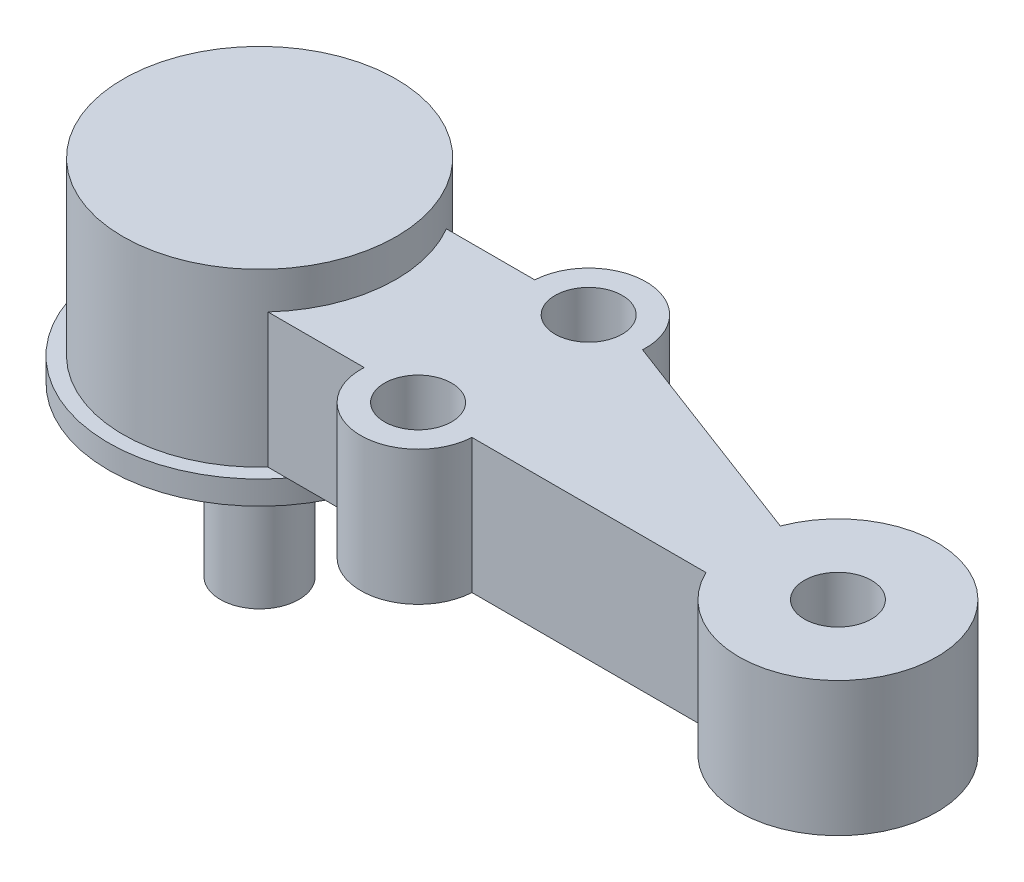
ISO-10303-21;
HEADER;
FILE_DESCRIPTION(('STEP AP214'),'2;1');
FILE_NAME('part.step','',(''),(''),'','','');
FILE_SCHEMA(('AUTOMOTIVE_DESIGN { 1 0 10303 214 1 1 1 1 }'));
ENDSEC;
DATA;
#1=APPLICATION_CONTEXT('core data for automotive mechanical design processes');
#2=APPLICATION_PROTOCOL_DEFINITION('international standard','automotive_design',2000,#1);
#3=PRODUCT_CONTEXT('',#1,'mechanical');
#4=PRODUCT('Part','Part','',(#3));
#5=PRODUCT_RELATED_PRODUCT_CATEGORY('part','',(#4));
#6=PRODUCT_DEFINITION_FORMATION('','',#4);
#7=PRODUCT_DEFINITION_CONTEXT('part definition',#1,'design');
#8=PRODUCT_DEFINITION('design','',#6,#7);
#9=PRODUCT_DEFINITION_SHAPE('','',#8);
#10=(LENGTH_UNIT() NAMED_UNIT(*) SI_UNIT(.MILLI.,.METRE.));
#11=(NAMED_UNIT(*) PLANE_ANGLE_UNIT() SI_UNIT($,.RADIAN.));
#12=(NAMED_UNIT(*) SI_UNIT($,.STERADIAN.) SOLID_ANGLE_UNIT());
#13=UNCERTAINTY_MEASURE_WITH_UNIT(LENGTH_MEASURE(1.E-05),#10,'distance_accuracy_value','');
#14=(GEOMETRIC_REPRESENTATION_CONTEXT(3) GLOBAL_UNCERTAINTY_ASSIGNED_CONTEXT((#13)) GLOBAL_UNIT_ASSIGNED_CONTEXT((#10,
#11,#12)) REPRESENTATION_CONTEXT('',''));
#15=CARTESIAN_POINT('',(0.,0.,0.));
#16=DIRECTION('',(0.,0.,1.));
#17=DIRECTION('',(1.,0.,0.));
#18=AXIS2_PLACEMENT_3D('',#15,#16,#17);
#19=CARTESIAN_POINT('',(0.663526213413153,20.,-12.0280884435094));
#20=DIRECTION('',(0.,1.,0.));
#21=DIRECTION('',(0.,0.,1.));
#22=AXIS2_PLACEMENT_3D('',#19,#20,#21);
#23=PLANE('',#22);
#24=CARTESIAN_POINT('',(-38.5468404711223,20.,-2.26882306285137));
#25=DIRECTION('',(0.,1.,0.));
#26=DIRECTION('',(0.,0.,1.));
#27=AXIS2_PLACEMENT_3D('',#24,#25,#26);
#28=CIRCLE('',#27,20.3270445555157);
#29=CARTESIAN_POINT('',(-23.5650556039314,20.,11.4692576821119));
#30=VERTEX_POINT('',#29);
#31=CARTESIAN_POINT('',(-20.9954678881363,20.,-12.5225082937881));
#32=VERTEX_POINT('',#31);
#33=EDGE_CURVE('E175',#30,#32,#28,.T.);
#34=ORIENTED_EDGE('',*,*,#33,.F.);
#35=DIRECTION('',(1.,0.,0.));
#36=VECTOR('',#35,1.);
#37=CARTESIAN_POINT('',(-9.24348048562234,20.,11.4692576821119));
#38=LINE('',#37,#36);
#39=CARTESIAN_POINT('',(-9.24348048562234,20.,11.4692576821119));
#40=VERTEX_POINT('',#39);
#41=EDGE_CURVE('E193',#30,#40,#38,.T.);
#42=ORIENTED_EDGE('',*,*,#41,.T.);
#43=CARTESIAN_POINT('',(-0.729753815586813,20.,11.9636775323906));
#44=DIRECTION('',(0.,1.,0.));
#45=DIRECTION('',(0.,0.,1.));
#46=AXIS2_PLACEMENT_3D('',#43,#44,#45);
#47=CIRCLE('',#46,8.52807087215062);
#48=CARTESIAN_POINT('',(7.78397285444871,20.,12.4580973826692));
#49=VERTEX_POINT('',#48);
#50=EDGE_CURVE('E118',#40,#49,#47,.T.);
#51=ORIENTED_EDGE('',*,*,#50,.T.);
#52=DIRECTION('',(1.,0.,0.));
#53=VECTOR('',#52,1.);
#54=CARTESIAN_POINT('',(7.78397285444871,20.,12.4580973826692));
#55=LINE('',#54,#53);
#56=CARTESIAN_POINT('',(42.6141049819233,20.,12.4580973826692));
#57=VERTEX_POINT('',#56);
#58=EDGE_CURVE('E110',#49,#57,#55,.T.);
#59=ORIENTED_EDGE('',*,*,#58,.T.);
#60=CARTESIAN_POINT('',(55.9309517504132,20.,6.14043343759059));
#61=DIRECTION('',(0.,1.,0.));
#62=DIRECTION('',(0.,0.,1.));
#63=AXIS2_PLACEMENT_3D('',#60,#61,#62);
#64=CIRCLE('',#63,14.7394465831789);
#65=CARTESIAN_POINT('',(42.1437413734169,20.,0.928512908761363));
#66=VERTEX_POINT('',#65);
#67=EDGE_CURVE('E115',#57,#66,#64,.T.);
#68=ORIENTED_EDGE('',*,*,#67,.T.);
#69=DIRECTION('',(-0.935395389453131,0.,-0.353603542671487));
#70=VECTOR('',#69,1.);
#71=CARTESIAN_POINT('',(9.17725288344868,20.,-11.5336685932308));
#72=LINE('',#71,#70);
#73=CARTESIAN_POINT('',(9.17725288344868,20.,-11.5336685932308));
#74=VERTEX_POINT('',#73);
#75=EDGE_CURVE('E58',#66,#74,#72,.T.);
#76=ORIENTED_EDGE('',*,*,#75,.T.);
#77=CARTESIAN_POINT('',(0.663526213413153,20.,-12.0280884435094));
#78=DIRECTION('',(0.,1.,0.));
#79=DIRECTION('',(0.,0.,1.));
#80=AXIS2_PLACEMENT_3D('',#77,#78,#79);
#81=CIRCLE('',#80,8.52807087215062);
#82=CARTESIAN_POINT('',(-7.85020045662237,20.,-12.5225082937881));
#83=VERTEX_POINT('',#82);
#84=EDGE_CURVE('E158',#74,#83,#81,.T.);
#85=ORIENTED_EDGE('',*,*,#84,.T.);
#86=DIRECTION('',(-1.,0.,0.));
#87=VECTOR('',#86,1.);
#88=CARTESIAN_POINT('',(-7.85020045662237,20.,-12.5225082937881));
#89=LINE('',#88,#87);
#90=EDGE_CURVE('E98',#83,#32,#89,.T.);
#91=ORIENTED_EDGE('',*,*,#90,.T.);
#92=EDGE_LOOP('',(#34,#42,#51,#59,#68,#76,#85,#91));
#93=FACE_BOUND('',#92,.T.);
#94=CARTESIAN_POINT('',(55.9309517504132,20.,6.14043343759059));
#95=DIRECTION('',(0.,1.,0.));
#96=DIRECTION('',(0.,0.,1.));
#97=AXIS2_PLACEMENT_3D('',#94,#95,#96);
#98=CIRCLE('',#97,5.);
#99=CARTESIAN_POINT('',(55.9309517504132,20.,11.1404334375906));
#100=VERTEX_POINT('',#99);
#101=EDGE_CURVE('E208',#100,#100,#98,.T.);
#102=ORIENTED_EDGE('',*,*,#101,.F.);
#103=EDGE_LOOP('',(#102));
#104=FACE_BOUND('',#103,.T.);
#105=CARTESIAN_POINT('',(0.663526213413153,20.,-12.0280884435094));
#106=DIRECTION('',(0.,1.,0.));
#107=DIRECTION('',(0.,0.,1.));
#108=AXIS2_PLACEMENT_3D('',#105,#106,#107);
#109=CIRCLE('',#108,5.00000000000005);
#110=CARTESIAN_POINT('',(0.663526213413153,20.,-7.02808844350937));
#111=VERTEX_POINT('',#110);
#112=EDGE_CURVE('E143',#111,#111,#109,.T.);
#113=ORIENTED_EDGE('',*,*,#112,.F.);
#114=EDGE_LOOP('',(#113));
#115=FACE_BOUND('',#114,.T.);
#116=CARTESIAN_POINT('',(-0.729753815586813,20.,11.9636775323906));
#117=DIRECTION('',(0.,1.,0.));
#118=DIRECTION('',(0.,0.,1.));
#119=AXIS2_PLACEMENT_3D('',#116,#117,#118);
#120=CIRCLE('',#119,4.99999999999999);
#121=CARTESIAN_POINT('',(-0.729753815586813,20.,16.9636775323906));
#122=VERTEX_POINT('',#121);
#123=EDGE_CURVE('E212',#122,#122,#120,.T.);
#124=ORIENTED_EDGE('',*,*,#123,.F.);
#125=EDGE_LOOP('',(#124));
#126=FACE_BOUND('',#125,.T.);
#127=ADVANCED_FACE('F33',(#93,#104,#115,#126),#23,.T.);
#128=CARTESIAN_POINT('',(0.663526213413153,0.,-12.0280884435094));
#129=DIRECTION('',(0.,1.,0.));
#130=DIRECTION('',(0.,0.,1.));
#131=AXIS2_PLACEMENT_3D('',#128,#129,#130);
#132=PLANE('',#131);
#133=CARTESIAN_POINT('',(-38.5468404711223,0.,-2.26882306285137));
#134=DIRECTION('',(0.,-1.,0.));
#135=DIRECTION('',(0.,0.,-1.));
#136=AXIS2_PLACEMENT_3D('',#133,#134,#135);
#137=CIRCLE('',#136,22.4854474260771);
#138=CARTESIAN_POINT('',(-18.5354116082013,0.,-12.5225082937881));
#139=VERTEX_POINT('',#138);
#140=CARTESIAN_POINT('',(-20.7462651041364,0.,11.4692576821119));
#141=VERTEX_POINT('',#140);
#142=EDGE_CURVE('E49',#139,#141,#137,.T.);
#143=ORIENTED_EDGE('',*,*,#142,.F.);
#144=DIRECTION('',(-1.,0.,0.));
#145=VECTOR('',#144,1.);
#146=CARTESIAN_POINT('',(-7.85020045662237,0.,-12.5225082937881));
#147=LINE('',#146,#145);
#148=CARTESIAN_POINT('',(-7.85020045662237,0.,-12.5225082937881));
#149=VERTEX_POINT('',#148);
#150=EDGE_CURVE('E144',#149,#139,#147,.T.);
#151=ORIENTED_EDGE('',*,*,#150,.F.);
#152=CARTESIAN_POINT('',(0.663526213413153,0.,-12.0280884435094));
#153=DIRECTION('',(0.,1.,0.));
#154=DIRECTION('',(0.,0.,1.));
#155=AXIS2_PLACEMENT_3D('',#152,#153,#154);
#156=CIRCLE('',#155,8.52807087215062);
#157=CARTESIAN_POINT('',(9.17725288344868,0.,-11.5336685932308));
#158=VERTEX_POINT('',#157);
#159=EDGE_CURVE('E139',#158,#149,#156,.T.);
#160=ORIENTED_EDGE('',*,*,#159,.F.);
#161=DIRECTION('',(-0.935395389453131,0.,-0.353603542671487));
#162=VECTOR('',#161,1.);
#163=CARTESIAN_POINT('',(9.17725288344868,0.,-11.5336685932308));
#164=LINE('',#163,#162);
#165=CARTESIAN_POINT('',(42.1437413734169,0.,0.928512908761363));
#166=VERTEX_POINT('',#165);
#167=EDGE_CURVE('E90',#166,#158,#164,.T.);
#168=ORIENTED_EDGE('',*,*,#167,.F.);
#169=CARTESIAN_POINT('',(55.9309517504132,0.,6.14043343759059));
#170=DIRECTION('',(0.,1.,0.));
#171=DIRECTION('',(0.,0.,1.));
#172=AXIS2_PLACEMENT_3D('',#169,#170,#171);
#173=CIRCLE('',#172,14.7394465831789);
#174=CARTESIAN_POINT('',(42.6141049819233,0.,12.4580973826692));
#175=VERTEX_POINT('',#174);
#176=EDGE_CURVE('E155',#175,#166,#173,.T.);
#177=ORIENTED_EDGE('',*,*,#176,.F.);
#178=DIRECTION('',(1.,0.,0.));
#179=VECTOR('',#178,1.);
#180=CARTESIAN_POINT('',(7.78397285444871,0.,12.4580973826692));
#181=LINE('',#180,#179);
#182=CARTESIAN_POINT('',(7.78397285444871,0.,12.4580973826692));
#183=VERTEX_POINT('',#182);
#184=EDGE_CURVE('E127',#183,#175,#181,.T.);
#185=ORIENTED_EDGE('',*,*,#184,.F.);
#186=CARTESIAN_POINT('',(-0.729753815586813,0.,11.9636775323906));
#187=DIRECTION('',(0.,1.,0.));
#188=DIRECTION('',(0.,0.,1.));
#189=AXIS2_PLACEMENT_3D('',#186,#187,#188);
#190=CIRCLE('',#189,8.52807087215062);
#191=CARTESIAN_POINT('',(-9.24348048562234,0.,11.4692576821119));
#192=VERTEX_POINT('',#191);
#193=EDGE_CURVE('E152',#192,#183,#190,.T.);
#194=ORIENTED_EDGE('',*,*,#193,.F.);
#195=DIRECTION('',(1.,0.,0.));
#196=VECTOR('',#195,1.);
#197=CARTESIAN_POINT('',(-9.24348048562234,0.,11.4692576821119));
#198=LINE('',#197,#196);
#199=EDGE_CURVE('E148',#141,#192,#198,.T.);
#200=ORIENTED_EDGE('',*,*,#199,.F.);
#201=EDGE_LOOP('',(#143,#151,#160,#168,#177,#185,#194,#200));
#202=FACE_BOUND('',#201,.T.);
#203=CARTESIAN_POINT('',(55.9309517504132,0.,6.14043343759059));
#204=DIRECTION('',(0.,1.,0.));
#205=DIRECTION('',(0.,0.,1.));
#206=AXIS2_PLACEMENT_3D('',#203,#204,#205);
#207=CIRCLE('',#206,5.);
#208=CARTESIAN_POINT('',(55.9309517504132,0.,11.1404334375906));
#209=VERTEX_POINT('',#208);
#210=EDGE_CURVE('E37',#209,#209,#207,.T.);
#211=ORIENTED_EDGE('',*,*,#210,.T.);
#212=EDGE_LOOP('',(#211));
#213=FACE_BOUND('',#212,.T.);
#214=CARTESIAN_POINT('',(0.663526213413153,0.,-12.0280884435094));
#215=DIRECTION('',(0.,1.,0.));
#216=DIRECTION('',(0.,0.,1.));
#217=AXIS2_PLACEMENT_3D('',#214,#215,#216);
#218=CIRCLE('',#217,5.00000000000005);
#219=CARTESIAN_POINT('',(0.663526213413153,0.,-7.02808844350937));
#220=VERTEX_POINT('',#219);
#221=EDGE_CURVE('E215',#220,#220,#218,.T.);
#222=ORIENTED_EDGE('',*,*,#221,.T.);
#223=EDGE_LOOP('',(#222));
#224=FACE_BOUND('',#223,.T.);
#225=CARTESIAN_POINT('',(-0.729753815586813,0.,11.9636775323906));
#226=DIRECTION('',(0.,1.,0.));
#227=DIRECTION('',(0.,0.,1.));
#228=AXIS2_PLACEMENT_3D('',#225,#226,#227);
#229=CIRCLE('',#228,4.99999999999999);
#230=CARTESIAN_POINT('',(-0.729753815586813,0.,16.9636775323906));
#231=VERTEX_POINT('',#230);
#232=EDGE_CURVE('E216',#231,#231,#229,.T.);
#233=ORIENTED_EDGE('',*,*,#232,.T.);
#234=EDGE_LOOP('',(#233));
#235=FACE_BOUND('',#234,.T.);
#236=ADVANCED_FACE('F189',(#202,#213,#224,#235),#132,.F.);
#237=CARTESIAN_POINT('',(0.663526213413153,20.,-12.0280884435094));
#238=DIRECTION('',(0.,-1.,0.));
#239=DIRECTION('',(0.,0.,-1.));
#240=AXIS2_PLACEMENT_3D('',#237,#238,#239);
#241=CYLINDRICAL_SURFACE('',#240,8.52807087215062);
#242=ORIENTED_EDGE('',*,*,#159,.T.);
#243=DIRECTION('',(0.,-1.,0.));
#244=VECTOR('',#243,1.);
#245=CARTESIAN_POINT('',(-7.85020045662237,20.,-12.5225082937881));
#246=LINE('',#245,#244);
#247=EDGE_CURVE('E11',#83,#149,#246,.T.);
#248=ORIENTED_EDGE('',*,*,#247,.F.);
#249=ORIENTED_EDGE('',*,*,#84,.F.);
#250=DIRECTION('',(0.,-1.,0.));
#251=VECTOR('',#250,1.);
#252=CARTESIAN_POINT('',(9.17725288344868,20.,-11.5336685932308));
#253=LINE('',#252,#251);
#254=EDGE_CURVE('E135',#74,#158,#253,.T.);
#255=ORIENTED_EDGE('',*,*,#254,.T.);
#256=EDGE_LOOP('',(#242,#248,#249,#255));
#257=FACE_BOUND('',#256,.T.);
#258=ADVANCED_FACE('F35',(#257),#241,.T.);
#259=CARTESIAN_POINT('',(-7.85020045662237,20.,-12.5225082937881));
#260=DIRECTION('',(0.,0.,1.));
#261=DIRECTION('',(1.,0.,0.));
#262=AXIS2_PLACEMENT_3D('',#259,#260,#261);
#263=PLANE('',#262);
#264=ORIENTED_EDGE('',*,*,#150,.T.);
#265=CARTESIAN_POINT('',(-20.9954678881363,0.,-12.5225082937881));
#266=VERTEX_POINT('',#265);
#267=EDGE_CURVE('E142',#139,#266,#147,.T.);
#268=ORIENTED_EDGE('',*,*,#267,.T.);
#269=DIRECTION('',(0.,-1.,0.));
#270=VECTOR('',#269,1.);
#271=CARTESIAN_POINT('',(-20.9954678881363,20.,-12.5225082937881));
#272=LINE('',#271,#270);
#273=EDGE_CURVE('E42',#32,#266,#272,.T.);
#274=ORIENTED_EDGE('',*,*,#273,.F.);
#275=ORIENTED_EDGE('',*,*,#90,.F.);
#276=ORIENTED_EDGE('',*,*,#247,.T.);
#277=EDGE_LOOP('',(#264,#268,#274,#275,#276));
#278=FACE_BOUND('',#277,.T.);
#279=ADVANCED_FACE('F228',(#278),#263,.F.);
#280=CARTESIAN_POINT('',(-38.5468404711223,20.,-2.26882306285137));
#281=DIRECTION('',(0.,-1.,0.));
#282=DIRECTION('',(0.,0.,-1.));
#283=AXIS2_PLACEMENT_3D('',#280,#281,#282);
#284=CYLINDRICAL_SURFACE('',#283,20.3270445555157);
#285=CARTESIAN_POINT('',(-38.5468404711223,0.,-2.26882306285137));
#286=DIRECTION('',(0.,1.,0.));
#287=DIRECTION('',(0.,0.,1.));
#288=AXIS2_PLACEMENT_3D('',#285,#286,#287);
#289=CIRCLE('',#288,20.3270445555157);
#290=CARTESIAN_POINT('',(-23.5650556039314,0.,11.4692576821119));
#291=VERTEX_POINT('',#290);
#292=EDGE_CURVE('E146',#266,#291,#289,.T.);
#293=ORIENTED_EDGE('',*,*,#292,.T.);
#294=DIRECTION('',(0.,-1.,0.));
#295=VECTOR('',#294,1.);
#296=CARTESIAN_POINT('',(-23.5650556039314,20.,11.4692576821119));
#297=LINE('',#296,#295);
#298=EDGE_CURVE('E165',#30,#291,#297,.T.);
#299=ORIENTED_EDGE('',*,*,#298,.F.);
#300=ORIENTED_EDGE('',*,*,#33,.T.);
#301=ORIENTED_EDGE('',*,*,#273,.T.);
#302=EDGE_LOOP('',(#293,#299,#300,#301));
#303=FACE_BOUND('',#302,.T.);
#304=CARTESIAN_POINT('',(-38.5468404711223,25.5,-2.26882306285137));
#305=DIRECTION('',(0.,1.,0.));
#306=DIRECTION('',(0.,0.,1.));
#307=AXIS2_PLACEMENT_3D('',#304,#305,#306);
#308=CIRCLE('',#307,20.3270445555157);
#309=CARTESIAN_POINT('',(-38.5468404711223,25.5,18.0582214926644));
#310=VERTEX_POINT('',#309);
#311=EDGE_CURVE('E195',#310,#310,#308,.T.);
#312=ORIENTED_EDGE('',*,*,#311,.F.);
#313=EDGE_LOOP('',(#312));
#314=FACE_BOUND('',#313,.T.);
#315=ADVANCED_FACE('F172',(#303,#314),#284,.T.);
#316=CARTESIAN_POINT('',(-9.24348048562234,20.,11.4692576821119));
#317=DIRECTION('',(0.,0.,-1.));
#318=DIRECTION('',(-1.,0.,0.));
#319=AXIS2_PLACEMENT_3D('',#316,#317,#318);
#320=PLANE('',#319);
#321=EDGE_CURVE('E149',#291,#141,#198,.T.);
#322=ORIENTED_EDGE('',*,*,#321,.T.);
#323=ORIENTED_EDGE('',*,*,#199,.T.);
#324=DIRECTION('',(0.,-1.,0.));
#325=VECTOR('',#324,1.);
#326=CARTESIAN_POINT('',(-9.24348048562234,20.,11.4692576821119));
#327=LINE('',#326,#325);
#328=EDGE_CURVE('E162',#40,#192,#327,.T.);
#329=ORIENTED_EDGE('',*,*,#328,.F.);
#330=ORIENTED_EDGE('',*,*,#41,.F.);
#331=ORIENTED_EDGE('',*,*,#298,.T.);
#332=EDGE_LOOP('',(#322,#323,#329,#330,#331));
#333=FACE_BOUND('',#332,.T.);
#334=ADVANCED_FACE('F184',(#333),#320,.F.);
#335=CARTESIAN_POINT('',(-0.729753815586813,20.,11.9636775323906));
#336=DIRECTION('',(0.,-1.,0.));
#337=DIRECTION('',(0.,0.,-1.));
#338=AXIS2_PLACEMENT_3D('',#335,#336,#337);
#339=CYLINDRICAL_SURFACE('',#338,8.52807087215062);
#340=ORIENTED_EDGE('',*,*,#193,.T.);
#341=DIRECTION('',(0.,-1.,0.));
#342=VECTOR('',#341,1.);
#343=CARTESIAN_POINT('',(7.78397285444871,20.,12.4580973826692));
#344=LINE('',#343,#342);
#345=EDGE_CURVE('E130',#49,#183,#344,.T.);
#346=ORIENTED_EDGE('',*,*,#345,.F.);
#347=ORIENTED_EDGE('',*,*,#50,.F.);
#348=ORIENTED_EDGE('',*,*,#328,.T.);
#349=EDGE_LOOP('',(#340,#346,#347,#348));
#350=FACE_BOUND('',#349,.T.);
#351=ADVANCED_FACE('F192',(#350),#339,.T.);
#352=CARTESIAN_POINT('',(7.78397285444871,20.,12.4580973826692));
#353=DIRECTION('',(0.,0.,-1.));
#354=DIRECTION('',(-1.,0.,0.));
#355=AXIS2_PLACEMENT_3D('',#352,#353,#354);
#356=PLANE('',#355);
#357=ORIENTED_EDGE('',*,*,#184,.T.);
#358=DIRECTION('',(0.,-1.,0.));
#359=VECTOR('',#358,1.);
#360=CARTESIAN_POINT('',(42.6141049819233,20.,12.4580973826692));
#361=LINE('',#360,#359);
#362=EDGE_CURVE('E124',#57,#175,#361,.T.);
#363=ORIENTED_EDGE('',*,*,#362,.F.);
#364=ORIENTED_EDGE('',*,*,#58,.F.);
#365=ORIENTED_EDGE('',*,*,#345,.T.);
#366=EDGE_LOOP('',(#357,#363,#364,#365));
#367=FACE_BOUND('',#366,.T.);
#368=ADVANCED_FACE('F125',(#367),#356,.F.);
#369=CARTESIAN_POINT('',(55.9309517504132,20.,6.14043343759059));
#370=DIRECTION('',(0.,-1.,0.));
#371=DIRECTION('',(0.,0.,-1.));
#372=AXIS2_PLACEMENT_3D('',#369,#370,#371);
#373=CYLINDRICAL_SURFACE('',#372,14.7394465831789);
#374=ORIENTED_EDGE('',*,*,#176,.T.);
#375=DIRECTION('',(0.,-1.,0.));
#376=VECTOR('',#375,1.);
#377=CARTESIAN_POINT('',(42.1437413734169,20.,0.928512908761363));
#378=LINE('',#377,#376);
#379=EDGE_CURVE('E131',#66,#166,#378,.T.);
#380=ORIENTED_EDGE('',*,*,#379,.F.);
#381=ORIENTED_EDGE('',*,*,#67,.F.);
#382=ORIENTED_EDGE('',*,*,#362,.T.);
#383=EDGE_LOOP('',(#374,#380,#381,#382));
#384=FACE_BOUND('',#383,.T.);
#385=ADVANCED_FACE('F133',(#384),#373,.T.);
#386=CARTESIAN_POINT('',(9.17725288344868,20.,-11.5336685932308));
#387=DIRECTION('',(-0.353603542671487,0.,0.935395389453131));
#388=DIRECTION('',(0.935395389453131,0.,0.353603542671487));
#389=AXIS2_PLACEMENT_3D('',#386,#387,#388);
#390=PLANE('',#389);
#391=ORIENTED_EDGE('',*,*,#167,.T.);
#392=ORIENTED_EDGE('',*,*,#254,.F.);
#393=ORIENTED_EDGE('',*,*,#75,.F.);
#394=ORIENTED_EDGE('',*,*,#379,.T.);
#395=EDGE_LOOP('',(#391,#392,#393,#394));
#396=FACE_BOUND('',#395,.T.);
#397=ADVANCED_FACE('F229',(#396),#390,.F.);
#398=CARTESIAN_POINT('',(0.663526213413153,20.,-12.0280884435094));
#399=DIRECTION('',(0.,-1.,0.));
#400=DIRECTION('',(0.,0.,-1.));
#401=AXIS2_PLACEMENT_3D('',#398,#399,#400);
#402=CYLINDRICAL_SURFACE('',#401,5.00000000000005);
#403=ORIENTED_EDGE('',*,*,#112,.T.);
#404=EDGE_LOOP('',(#403));
#405=FACE_BOUND('',#404,.T.);
#406=ORIENTED_EDGE('',*,*,#221,.F.);
#407=EDGE_LOOP('',(#406));
#408=FACE_BOUND('',#407,.T.);
#409=ADVANCED_FACE('F231',(#405,#408),#402,.F.);
#410=CARTESIAN_POINT('',(-0.729753815586813,20.,11.9636775323906));
#411=DIRECTION('',(0.,-1.,0.));
#412=DIRECTION('',(0.,0.,-1.));
#413=AXIS2_PLACEMENT_3D('',#410,#411,#412);
#414=CYLINDRICAL_SURFACE('',#413,4.99999999999999);
#415=ORIENTED_EDGE('',*,*,#123,.T.);
#416=EDGE_LOOP('',(#415));
#417=FACE_BOUND('',#416,.T.);
#418=ORIENTED_EDGE('',*,*,#232,.F.);
#419=EDGE_LOOP('',(#418));
#420=FACE_BOUND('',#419,.T.);
#421=ADVANCED_FACE('F237',(#417,#420),#414,.F.);
#422=CARTESIAN_POINT('',(55.9309517504132,-55.,6.14043343759059));
#423=DIRECTION('',(0.,1.,0.));
#424=DIRECTION('',(0.,0.,1.));
#425=AXIS2_PLACEMENT_3D('',#422,#423,#424);
#426=CYLINDRICAL_SURFACE('',#425,5.);
#427=ORIENTED_EDGE('',*,*,#101,.T.);
#428=EDGE_LOOP('',(#427));
#429=FACE_BOUND('',#428,.T.);
#430=ORIENTED_EDGE('',*,*,#210,.F.);
#431=EDGE_LOOP('',(#430));
#432=FACE_BOUND('',#431,.T.);
#433=ADVANCED_FACE('F250',(#429,#432),#426,.F.);
#434=CARTESIAN_POINT('',(-38.5468404711223,-3.5,-2.26882306285137));
#435=DIRECTION('',(0.,1.,0.));
#436=DIRECTION('',(0.,0.,1.));
#437=AXIS2_PLACEMENT_3D('',#434,#435,#436);
#438=CYLINDRICAL_SURFACE('',#437,22.4854474260771);
#439=CARTESIAN_POINT('',(-38.5468404711223,-3.5,-2.26882306285137));
#440=DIRECTION('',(0.,-1.,0.));
#441=DIRECTION('',(0.,0.,-1.));
#442=AXIS2_PLACEMENT_3D('',#439,#440,#441);
#443=CIRCLE('',#442,22.4854474260771);
#444=CARTESIAN_POINT('',(-38.5468404711223,-3.5,-24.7542704889285));
#445=VERTEX_POINT('',#444);
#446=EDGE_CURVE('E205',#445,#445,#443,.T.);
#447=ORIENTED_EDGE('',*,*,#446,.F.);
#448=EDGE_LOOP('',(#447));
#449=FACE_BOUND('',#448,.T.);
#450=ORIENTED_EDGE('',*,*,#142,.T.);
#451=EDGE_CURVE('E182',#141,#139,#137,.T.);
#452=ORIENTED_EDGE('',*,*,#451,.T.);
#453=EDGE_LOOP('',(#450,#452));
#454=FACE_BOUND('',#453,.T.);
#455=ADVANCED_FACE('F254',(#449,#454),#438,.T.);
#456=CARTESIAN_POINT('',(-38.5468404711223,-3.5,-2.26882306285137));
#457=DIRECTION('',(0.,-1.,0.));
#458=DIRECTION('',(0.,0.,-1.));
#459=AXIS2_PLACEMENT_3D('',#456,#457,#458);
#460=PLANE('',#459);
#461=CARTESIAN_POINT('',(-38.5468404711223,-3.5,-2.26882306285137));
#462=DIRECTION('',(0.,-1.,0.));
#463=DIRECTION('',(0.,0.,-1.));
#464=AXIS2_PLACEMENT_3D('',#461,#462,#463);
#465=CIRCLE('',#464,18.0430789541958);
#466=CARTESIAN_POINT('',(-38.5468404711223,-3.5,-20.3119020170472));
#467=VERTEX_POINT('',#466);
#468=EDGE_CURVE('E201',#467,#467,#465,.T.);
#469=ORIENTED_EDGE('',*,*,#468,.F.);
#470=EDGE_LOOP('',(#469));
#471=FACE_BOUND('',#470,.T.);
#472=ORIENTED_EDGE('',*,*,#446,.T.);
#473=EDGE_LOOP('',(#472));
#474=FACE_BOUND('',#473,.T.);
#475=ADVANCED_FACE('F258',(#471,#474),#460,.T.);
#476=CARTESIAN_POINT('',(-38.5468404711223,0.,-2.26882306285137));
#477=DIRECTION('',(0.,-1.,0.));
#478=DIRECTION('',(0.,0.,-1.));
#479=AXIS2_PLACEMENT_3D('',#476,#477,#478);
#480=PLANE('',#479);
#481=ORIENTED_EDGE('',*,*,#321,.F.);
#482=ORIENTED_EDGE('',*,*,#292,.F.);
#483=ORIENTED_EDGE('',*,*,#267,.F.);
#484=ORIENTED_EDGE('',*,*,#451,.F.);
#485=EDGE_LOOP('',(#481,#482,#483,#484));
#486=FACE_BOUND('',#485,.T.);
#487=ADVANCED_FACE('F179',(#486),#480,.F.);
#488=CARTESIAN_POINT('',(-38.5468404711223,25.5,-2.26882306285137));
#489=DIRECTION('',(0.,1.,0.));
#490=DIRECTION('',(0.,0.,1.));
#491=AXIS2_PLACEMENT_3D('',#488,#489,#490);
#492=PLANE('',#491);
#493=ORIENTED_EDGE('',*,*,#311,.T.);
#494=EDGE_LOOP('',(#493));
#495=FACE_BOUND('',#494,.T.);
#496=ADVANCED_FACE('F262',(#495),#492,.T.);
#497=CARTESIAN_POINT('',(-38.5468404711223,-1.5,-2.26882306285137));
#498=DIRECTION('',(0.,-1.,0.));
#499=DIRECTION('',(0.,0.,-1.));
#500=AXIS2_PLACEMENT_3D('',#497,#498,#499);
#501=CYLINDRICAL_SURFACE('',#500,18.0430789541958);
#502=CARTESIAN_POINT('',(-38.5468404711223,-1.5,-2.26882306285137));
#503=DIRECTION('',(0.,-1.,0.));
#504=DIRECTION('',(0.,0.,-1.));
#505=AXIS2_PLACEMENT_3D('',#502,#503,#504);
#506=CIRCLE('',#505,18.0430789541958);
#507=CARTESIAN_POINT('',(-38.5468404711223,-1.5,-20.3119020170472));
#508=VERTEX_POINT('',#507);
#509=EDGE_CURVE('E196',#508,#508,#506,.T.);
#510=ORIENTED_EDGE('',*,*,#509,.F.);
#511=EDGE_LOOP('',(#510));
#512=FACE_BOUND('',#511,.T.);
#513=ORIENTED_EDGE('',*,*,#468,.T.);
#514=EDGE_LOOP('',(#513));
#515=FACE_BOUND('',#514,.T.);
#516=ADVANCED_FACE('F268',(#512,#515),#501,.F.);
#517=CARTESIAN_POINT('',(-38.5468404711223,-1.5,-2.26882306285137));
#518=DIRECTION('',(0.,-1.,0.));
#519=DIRECTION('',(0.,0.,-1.));
#520=AXIS2_PLACEMENT_3D('',#517,#518,#519);
#521=PLANE('',#520);
#522=CARTESIAN_POINT('',(-38.5468404711223,-1.5,-2.26882306285137));
#523=DIRECTION('',(0.,-1.,0.));
#524=DIRECTION('',(0.,0.,-1.));
#525=AXIS2_PLACEMENT_3D('',#522,#523,#524);
#526=CIRCLE('',#525,5.85351433663626);
#527=CARTESIAN_POINT('',(-38.5468404711223,-1.5,-8.12233739948763));
#528=VERTEX_POINT('',#527);
#529=EDGE_CURVE('E290',#528,#528,#526,.T.);
#530=ORIENTED_EDGE('',*,*,#529,.F.);
#531=EDGE_LOOP('',(#530));
#532=FACE_BOUND('',#531,.T.);
#533=ORIENTED_EDGE('',*,*,#509,.T.);
#534=EDGE_LOOP('',(#533));
#535=FACE_BOUND('',#534,.T.);
#536=ADVANCED_FACE('F272',(#532,#535),#521,.T.);
#537=CARTESIAN_POINT('',(-38.5468404711223,-1.5,-2.26882306285137));
#538=DIRECTION('',(0.,-1.,0.));
#539=DIRECTION('',(0.,0.,-1.));
#540=AXIS2_PLACEMENT_3D('',#537,#538,#539);
#541=CYLINDRICAL_SURFACE('',#540,5.85351433663626);
#542=ORIENTED_EDGE('',*,*,#529,.T.);
#543=EDGE_LOOP('',(#542));
#544=FACE_BOUND('',#543,.T.);
#545=CARTESIAN_POINT('',(-38.5468404711223,-28.5,-2.26882306285137));
#546=DIRECTION('',(0.,-1.,0.));
#547=DIRECTION('',(0.,0.,-1.));
#548=AXIS2_PLACEMENT_3D('',#545,#546,#547);
#549=CIRCLE('',#548,5.85351433663626);
#550=CARTESIAN_POINT('',(-38.5468404711223,-28.5,-8.12233739948763));
#551=VERTEX_POINT('',#550);
#552=EDGE_CURVE('E288',#551,#551,#549,.T.);
#553=ORIENTED_EDGE('',*,*,#552,.F.);
#554=EDGE_LOOP('',(#553));
#555=FACE_BOUND('',#554,.T.);
#556=ADVANCED_FACE('F276',(#544,#555),#541,.T.);
#557=CARTESIAN_POINT('',(-38.5468404711223,-28.5,-2.26882306285137));
#558=DIRECTION('',(0.,-1.,0.));
#559=DIRECTION('',(0.,0.,-1.));
#560=AXIS2_PLACEMENT_3D('',#557,#558,#559);
#561=PLANE('',#560);
#562=ORIENTED_EDGE('',*,*,#552,.T.);
#563=EDGE_LOOP('',(#562));
#564=FACE_BOUND('',#563,.T.);
#565=ADVANCED_FACE('F280',(#564),#561,.T.);
#566=CLOSED_SHELL('',(#127,#236,#258,#279,#315,#334,#351,#368,#385,#397,#409,#421,#433,#455,
#475,#487,#496,#516,#536,#556,#565));
#567=MANIFOLD_SOLID_BREP('B2',#566);
#568=ADVANCED_BREP_SHAPE_REPRESENTATION('',(#18,#567),#14);
#569=SHAPE_DEFINITION_REPRESENTATION(#9,#568);
ENDSEC;
END-ISO-10303-21;
